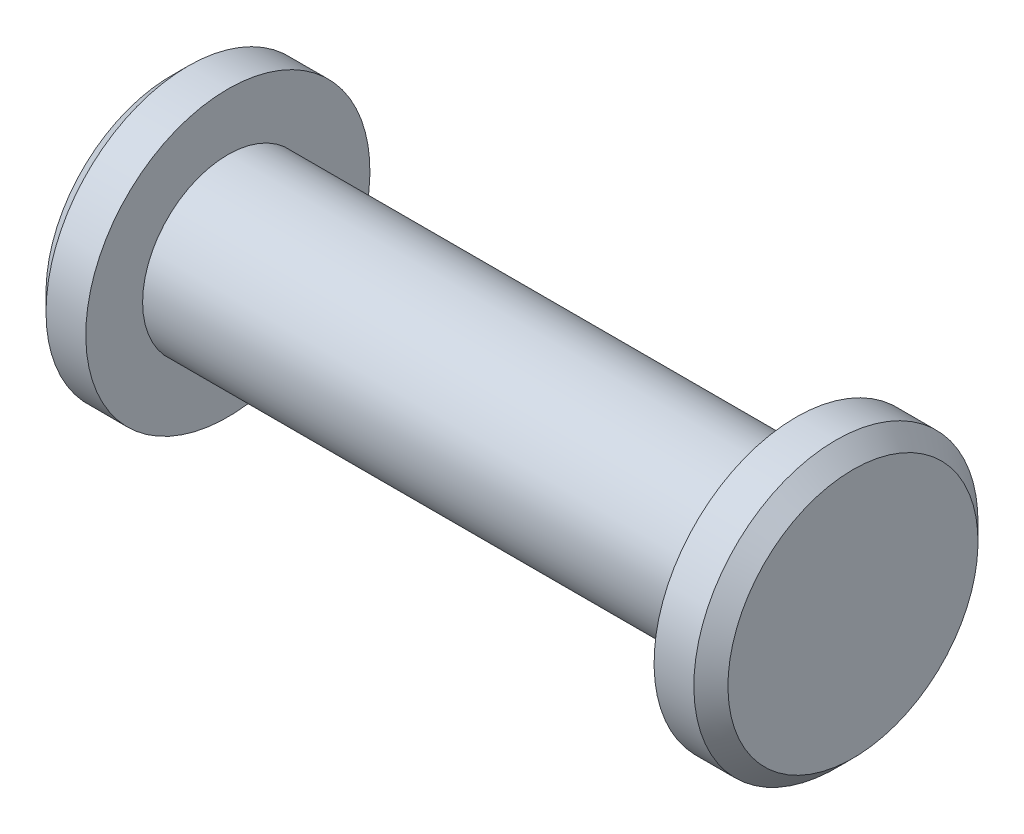
ISO-10303-21;
HEADER;
FILE_DESCRIPTION(('STEP AP214'),'2;1');
FILE_NAME('part.step','',(''),(''),'','','');
FILE_SCHEMA(('AUTOMOTIVE_DESIGN { 1 0 10303 214 1 1 1 1 }'));
ENDSEC;
DATA;
#1=APPLICATION_CONTEXT('core data for automotive mechanical design processes');
#2=APPLICATION_PROTOCOL_DEFINITION('international standard','automotive_design',2000,#1);
#3=PRODUCT_CONTEXT('',#1,'mechanical');
#4=PRODUCT('Part','Part','',(#3));
#5=PRODUCT_RELATED_PRODUCT_CATEGORY('part','',(#4));
#6=PRODUCT_DEFINITION_FORMATION('','',#4);
#7=PRODUCT_DEFINITION_CONTEXT('part definition',#1,'design');
#8=PRODUCT_DEFINITION('design','',#6,#7);
#9=PRODUCT_DEFINITION_SHAPE('','',#8);
#10=(LENGTH_UNIT() NAMED_UNIT(*) SI_UNIT(.MILLI.,.METRE.));
#11=(NAMED_UNIT(*) PLANE_ANGLE_UNIT() SI_UNIT($,.RADIAN.));
#12=(NAMED_UNIT(*) SI_UNIT($,.STERADIAN.) SOLID_ANGLE_UNIT());
#13=UNCERTAINTY_MEASURE_WITH_UNIT(LENGTH_MEASURE(1.E-05),#10,'distance_accuracy_value','');
#14=(GEOMETRIC_REPRESENTATION_CONTEXT(3) GLOBAL_UNCERTAINTY_ASSIGNED_CONTEXT((#13)) GLOBAL_UNIT_ASSIGNED_CONTEXT((#10,
#11,#12)) REPRESENTATION_CONTEXT('',''));
#15=CARTESIAN_POINT('',(0.,0.,0.));
#16=DIRECTION('',(0.,0.,1.));
#17=DIRECTION('',(1.,0.,0.));
#18=AXIS2_PLACEMENT_3D('',#15,#16,#17);
#19=CARTESIAN_POINT('',(-120.,0.,0.));
#20=DIRECTION('',(-1.,0.,0.));
#21=DIRECTION('',(0.,-1.,0.));
#22=AXIS2_PLACEMENT_3D('',#19,#20,#21);
#23=PLANE('',#22);
#24=CARTESIAN_POINT('',(-120.,0.,0.));
#25=DIRECTION('',(-1.,0.,0.));
#26=DIRECTION('',(0.,-1.,0.));
#27=AXIS2_PLACEMENT_3D('',#24,#25,#26);
#28=CIRCLE('',#27,22.);
#29=CARTESIAN_POINT('',(-120.,-22.,0.));
#30=VERTEX_POINT('',#29);
#31=EDGE_CURVE('E45',#30,#30,#28,.T.);
#32=ORIENTED_EDGE('',*,*,#31,.T.);
#33=EDGE_LOOP('',(#32));
#34=FACE_BOUND('',#33,.T.);
#35=ADVANCED_FACE('F33',(#34),#23,.T.);
#36=CARTESIAN_POINT('',(0.,0.,0.));
#37=DIRECTION('',(1.,0.,0.));
#38=DIRECTION('',(0.,1.,0.));
#39=AXIS2_PLACEMENT_3D('',#36,#37,#38);
#40=CYLINDRICAL_SURFACE('',#39,25.);
#41=CARTESIAN_POINT('',(-117.,0.,0.));
#42=DIRECTION('',(-1.,0.,0.));
#43=DIRECTION('',(0.,-1.,0.));
#44=AXIS2_PLACEMENT_3D('',#41,#42,#43);
#45=CIRCLE('',#44,25.);
#46=CARTESIAN_POINT('',(-117.,-25.,0.));
#47=VERTEX_POINT('',#46);
#48=EDGE_CURVE('E49',#47,#47,#45,.F.);
#49=ORIENTED_EDGE('',*,*,#48,.T.);
#50=EDGE_LOOP('',(#49));
#51=FACE_BOUND('',#50,.T.);
#52=CARTESIAN_POINT('',(-110.,0.,0.));
#53=DIRECTION('',(1.,0.,0.));
#54=DIRECTION('',(0.,1.,0.));
#55=AXIS2_PLACEMENT_3D('',#52,#53,#54);
#56=CIRCLE('',#55,25.);
#57=CARTESIAN_POINT('',(-110.,25.,0.));
#58=VERTEX_POINT('',#57);
#59=EDGE_CURVE('E54',#58,#58,#56,.T.);
#60=ORIENTED_EDGE('',*,*,#59,.F.);
#61=EDGE_LOOP('',(#60));
#62=FACE_BOUND('',#61,.T.);
#63=ADVANCED_FACE('F84',(#51,#62),#40,.T.);
#64=CARTESIAN_POINT('',(-110.,25.,0.));
#65=DIRECTION('',(1.,0.,0.));
#66=DIRECTION('',(0.,1.,0.));
#67=AXIS2_PLACEMENT_3D('',#64,#65,#66);
#68=PLANE('',#67);
#69=ORIENTED_EDGE('',*,*,#59,.T.);
#70=EDGE_LOOP('',(#69));
#71=FACE_BOUND('',#70,.T.);
#72=CARTESIAN_POINT('',(-110.,0.,0.));
#73=DIRECTION('',(1.,0.,0.));
#74=DIRECTION('',(0.,1.,0.));
#75=AXIS2_PLACEMENT_3D('',#72,#73,#74);
#76=CIRCLE('',#75,15.);
#77=CARTESIAN_POINT('',(-110.,15.,0.));
#78=VERTEX_POINT('',#77);
#79=EDGE_CURVE('E57',#78,#78,#76,.T.);
#80=ORIENTED_EDGE('',*,*,#79,.F.);
#81=EDGE_LOOP('',(#80));
#82=FACE_BOUND('',#81,.T.);
#83=ADVANCED_FACE('F80',(#71,#82),#68,.T.);
#84=CARTESIAN_POINT('',(0.,0.,0.));
#85=DIRECTION('',(1.,0.,0.));
#86=DIRECTION('',(0.,1.,0.));
#87=AXIS2_PLACEMENT_3D('',#84,#85,#86);
#88=CYLINDRICAL_SURFACE('',#87,15.);
#89=ORIENTED_EDGE('',*,*,#79,.T.);
#90=EDGE_LOOP('',(#89));
#91=FACE_BOUND('',#90,.T.);
#92=CARTESIAN_POINT('',(-10.,0.,0.));
#93=DIRECTION('',(1.,0.,0.));
#94=DIRECTION('',(0.,1.,0.));
#95=AXIS2_PLACEMENT_3D('',#92,#93,#94);
#96=CIRCLE('',#95,15.);
#97=CARTESIAN_POINT('',(-10.,15.,0.));
#98=VERTEX_POINT('',#97);
#99=EDGE_CURVE('E60',#98,#98,#96,.T.);
#100=ORIENTED_EDGE('',*,*,#99,.F.);
#101=EDGE_LOOP('',(#100));
#102=FACE_BOUND('',#101,.T.);
#103=ADVANCED_FACE('F71',(#91,#102),#88,.T.);
#104=CARTESIAN_POINT('',(-9.99999999999999,15.,0.));
#105=DIRECTION('',(-1.,0.,0.));
#106=DIRECTION('',(0.,-1.,0.));
#107=AXIS2_PLACEMENT_3D('',#104,#105,#106);
#108=PLANE('',#107);
#109=ORIENTED_EDGE('',*,*,#99,.T.);
#110=EDGE_LOOP('',(#109));
#111=FACE_BOUND('',#110,.T.);
#112=CARTESIAN_POINT('',(-9.99999999999999,0.,0.));
#113=DIRECTION('',(1.,0.,0.));
#114=DIRECTION('',(0.,1.,0.));
#115=AXIS2_PLACEMENT_3D('',#112,#113,#114);
#116=CIRCLE('',#115,25.);
#117=CARTESIAN_POINT('',(-9.99999999999999,25.,0.));
#118=VERTEX_POINT('',#117);
#119=EDGE_CURVE('E63',#118,#118,#116,.T.);
#120=ORIENTED_EDGE('',*,*,#119,.F.);
#121=EDGE_LOOP('',(#120));
#122=FACE_BOUND('',#121,.T.);
#123=ADVANCED_FACE('F69',(#111,#122),#108,.T.);
#124=CARTESIAN_POINT('',(0.,0.,0.));
#125=DIRECTION('',(1.,0.,0.));
#126=DIRECTION('',(0.,1.,0.));
#127=AXIS2_PLACEMENT_3D('',#124,#125,#126);
#128=CYLINDRICAL_SURFACE('',#127,25.);
#129=CARTESIAN_POINT('',(-2.99999999999998,0.,0.));
#130=DIRECTION('',(1.,0.,0.));
#131=DIRECTION('',(0.,1.,0.));
#132=AXIS2_PLACEMENT_3D('',#129,#130,#131);
#133=CIRCLE('',#132,25.);
#134=CARTESIAN_POINT('',(-2.99999999999998,25.,0.));
#135=VERTEX_POINT('',#134);
#136=EDGE_CURVE('E10',#135,#135,#133,.F.);
#137=ORIENTED_EDGE('',*,*,#136,.T.);
#138=EDGE_LOOP('',(#137));
#139=FACE_BOUND('',#138,.T.);
#140=ORIENTED_EDGE('',*,*,#119,.T.);
#141=EDGE_LOOP('',(#140));
#142=FACE_BOUND('',#141,.T.);
#143=ADVANCED_FACE('F67',(#139,#142),#128,.T.);
#144=CARTESIAN_POINT('',(0.,25.,0.));
#145=DIRECTION('',(1.,0.,0.));
#146=DIRECTION('',(0.,1.,0.));
#147=AXIS2_PLACEMENT_3D('',#144,#145,#146);
#148=PLANE('',#147);
#149=CARTESIAN_POINT('',(0.,0.,0.));
#150=DIRECTION('',(1.,0.,0.));
#151=DIRECTION('',(0.,1.,0.));
#152=AXIS2_PLACEMENT_3D('',#149,#150,#151);
#153=CIRCLE('',#152,22.);
#154=CARTESIAN_POINT('',(0.,22.,0.));
#155=VERTEX_POINT('',#154);
#156=EDGE_CURVE('E41',#155,#155,#153,.T.);
#157=ORIENTED_EDGE('',*,*,#156,.T.);
#158=EDGE_LOOP('',(#157));
#159=FACE_BOUND('',#158,.T.);
#160=ADVANCED_FACE('F78',(#159),#148,.T.);
#161=CARTESIAN_POINT('',(-117.,0.,0.));
#162=DIRECTION('',(1.,0.,0.));
#163=DIRECTION('',(0.,1.,0.));
#164=AXIS2_PLACEMENT_3D('',#161,#162,#163);
#165=CONICAL_SURFACE('',#164,25.,0.78539816339745);
#166=ORIENTED_EDGE('',*,*,#31,.F.);
#167=EDGE_LOOP('',(#166));
#168=FACE_BOUND('',#167,.T.);
#169=ORIENTED_EDGE('',*,*,#48,.F.);
#170=EDGE_LOOP('',(#169));
#171=FACE_BOUND('',#170,.T.);
#172=ADVANCED_FACE('F94',(#168,#171),#165,.T.);
#173=CARTESIAN_POINT('',(0.,0.,0.));
#174=DIRECTION('',(-1.,0.,0.));
#175=DIRECTION('',(0.,-1.,0.));
#176=AXIS2_PLACEMENT_3D('',#173,#174,#175);
#177=CONICAL_SURFACE('',#176,22.,0.785398163397448);
#178=ORIENTED_EDGE('',*,*,#136,.F.);
#179=EDGE_LOOP('',(#178));
#180=FACE_BOUND('',#179,.T.);
#181=ORIENTED_EDGE('',*,*,#156,.F.);
#182=EDGE_LOOP('',(#181));
#183=FACE_BOUND('',#182,.T.);
#184=ADVANCED_FACE('F36',(#180,#183),#177,.T.);
#185=CLOSED_SHELL('',(#35,#63,#83,#103,#123,#143,#160,#172,#184));
#186=MANIFOLD_SOLID_BREP('B2',#185);
#187=ADVANCED_BREP_SHAPE_REPRESENTATION('',(#18,#186),#14);
#188=SHAPE_DEFINITION_REPRESENTATION(#9,#187);
ENDSEC;
END-ISO-10303-21;
